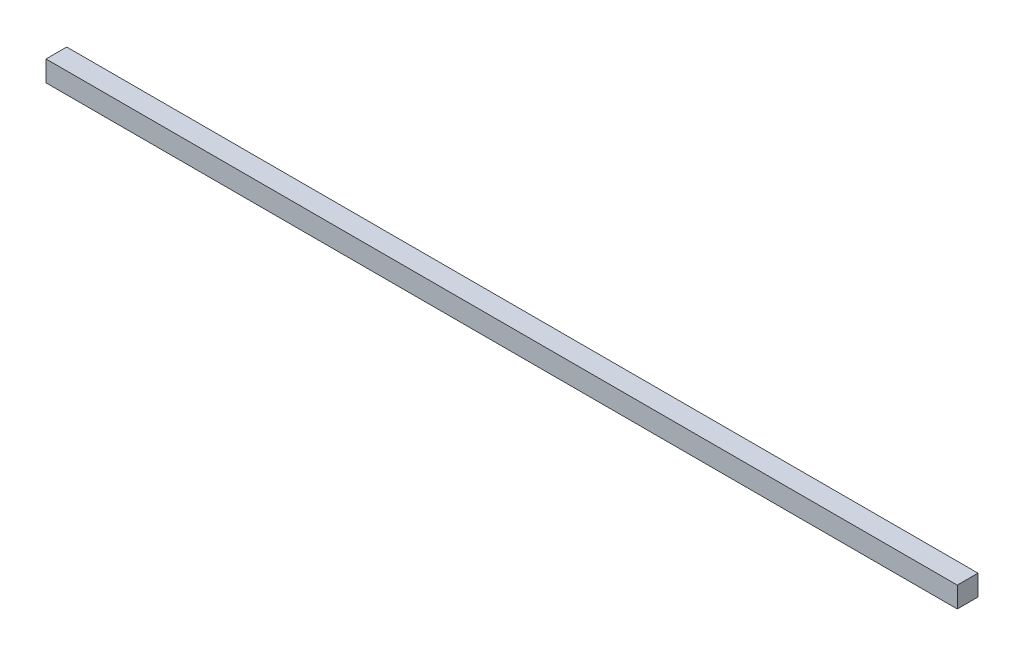
ISO-10303-21;
HEADER;
FILE_DESCRIPTION(('STEP AP214'),'2;1');
FILE_NAME('part.step','',(''),(''),'','','');
FILE_SCHEMA(('AUTOMOTIVE_DESIGN { 1 0 10303 214 1 1 1 1 }'));
ENDSEC;
DATA;
#1=APPLICATION_CONTEXT('core data for automotive mechanical design processes');
#2=APPLICATION_PROTOCOL_DEFINITION('international standard','automotive_design',2000,#1);
#3=PRODUCT_CONTEXT('',#1,'mechanical');
#4=PRODUCT('Part','Part','',(#3));
#5=PRODUCT_RELATED_PRODUCT_CATEGORY('part','',(#4));
#6=PRODUCT_DEFINITION_FORMATION('','',#4);
#7=PRODUCT_DEFINITION_CONTEXT('part definition',#1,'design');
#8=PRODUCT_DEFINITION('design','',#6,#7);
#9=PRODUCT_DEFINITION_SHAPE('','',#8);
#10=(LENGTH_UNIT() NAMED_UNIT(*) SI_UNIT(.MILLI.,.METRE.));
#11=(NAMED_UNIT(*) PLANE_ANGLE_UNIT() SI_UNIT($,.RADIAN.));
#12=(NAMED_UNIT(*) SI_UNIT($,.STERADIAN.) SOLID_ANGLE_UNIT());
#13=UNCERTAINTY_MEASURE_WITH_UNIT(LENGTH_MEASURE(1.E-05),#10,'distance_accuracy_value','');
#14=(GEOMETRIC_REPRESENTATION_CONTEXT(3) GLOBAL_UNCERTAINTY_ASSIGNED_CONTEXT((#13)) GLOBAL_UNIT_ASSIGNED_CONTEXT((#10,
#11,#12)) REPRESENTATION_CONTEXT('',''));
#15=CARTESIAN_POINT('',(0.,0.,0.));
#16=DIRECTION('',(0.,0.,1.));
#17=DIRECTION('',(1.,0.,0.));
#18=AXIS2_PLACEMENT_3D('',#15,#16,#17);
#19=CARTESIAN_POINT('',(0.,0.,3.));
#20=DIRECTION('',(1.,0.,0.));
#21=DIRECTION('',(0.,0.,-1.));
#22=AXIS2_PLACEMENT_3D('',#19,#20,#21);
#23=PLANE('',#22);
#24=DIRECTION('',(0.,-1.,0.));
#25=VECTOR('',#24,1.);
#26=CARTESIAN_POINT('',(0.,0.,0.));
#27=LINE('',#26,#25);
#28=CARTESIAN_POINT('',(0.,3.,0.));
#29=VERTEX_POINT('',#28);
#30=CARTESIAN_POINT('',(0.,0.,0.));
#31=VERTEX_POINT('',#30);
#32=EDGE_CURVE('E108',#29,#31,#27,.T.);
#33=ORIENTED_EDGE('',*,*,#32,.T.);
#34=DIRECTION('',(0.,0.,-1.));
#35=VECTOR('',#34,1.);
#36=CARTESIAN_POINT('',(0.,0.,3.));
#37=LINE('',#36,#35);
#38=CARTESIAN_POINT('',(0.,0.,3.));
#39=VERTEX_POINT('',#38);
#40=EDGE_CURVE('E11',#39,#31,#37,.T.);
#41=ORIENTED_EDGE('',*,*,#40,.F.);
#42=DIRECTION('',(0.,-1.,0.));
#43=VECTOR('',#42,1.);
#44=CARTESIAN_POINT('',(0.,0.,3.));
#45=LINE('',#44,#43);
#46=CARTESIAN_POINT('',(0.,3.,3.));
#47=VERTEX_POINT('',#46);
#48=EDGE_CURVE('E92',#47,#39,#45,.T.);
#49=ORIENTED_EDGE('',*,*,#48,.F.);
#50=DIRECTION('',(0.,0.,-1.));
#51=VECTOR('',#50,1.);
#52=CARTESIAN_POINT('',(0.,3.,3.));
#53=LINE('',#52,#51);
#54=EDGE_CURVE('E105',#47,#29,#53,.T.);
#55=ORIENTED_EDGE('',*,*,#54,.T.);
#56=EDGE_LOOP('',(#33,#41,#49,#55));
#57=FACE_BOUND('',#56,.T.);
#58=ADVANCED_FACE('F43',(#57),#23,.F.);
#59=CARTESIAN_POINT('',(0.,0.,3.));
#60=DIRECTION('',(0.,1.,0.));
#61=DIRECTION('',(0.,0.,1.));
#62=AXIS2_PLACEMENT_3D('',#59,#60,#61);
#63=PLANE('',#62);
#64=DIRECTION('',(1.,0.,0.));
#65=VECTOR('',#64,1.);
#66=CARTESIAN_POINT('',(0.,0.,0.));
#67=LINE('',#66,#65);
#68=CARTESIAN_POINT('',(132.,0.,0.));
#69=VERTEX_POINT('',#68);
#70=EDGE_CURVE('E97',#31,#69,#67,.T.);
#71=ORIENTED_EDGE('',*,*,#70,.T.);
#72=DIRECTION('',(0.,0.,-1.));
#73=VECTOR('',#72,1.);
#74=CARTESIAN_POINT('',(132.,0.,3.));
#75=LINE('',#74,#73);
#76=CARTESIAN_POINT('',(132.,0.,3.));
#77=VERTEX_POINT('',#76);
#78=EDGE_CURVE('E51',#77,#69,#75,.T.);
#79=ORIENTED_EDGE('',*,*,#78,.F.);
#80=DIRECTION('',(1.,0.,0.));
#81=VECTOR('',#80,1.);
#82=CARTESIAN_POINT('',(0.,0.,3.));
#83=LINE('',#82,#81);
#84=EDGE_CURVE('E87',#39,#77,#83,.T.);
#85=ORIENTED_EDGE('',*,*,#84,.F.);
#86=ORIENTED_EDGE('',*,*,#40,.T.);
#87=EDGE_LOOP('',(#71,#79,#85,#86));
#88=FACE_BOUND('',#87,.T.);
#89=ADVANCED_FACE('F100',(#88),#63,.F.);
#90=CARTESIAN_POINT('',(132.,0.,3.));
#91=DIRECTION('',(-1.,0.,0.));
#92=DIRECTION('',(0.,0.,1.));
#93=AXIS2_PLACEMENT_3D('',#90,#91,#92);
#94=PLANE('',#93);
#95=DIRECTION('',(0.,1.,0.));
#96=VECTOR('',#95,1.);
#97=CARTESIAN_POINT('',(132.,0.,0.));
#98=LINE('',#97,#96);
#99=CARTESIAN_POINT('',(132.,3.,0.));
#100=VERTEX_POINT('',#99);
#101=EDGE_CURVE('E78',#69,#100,#98,.T.);
#102=ORIENTED_EDGE('',*,*,#101,.T.);
#103=DIRECTION('',(0.,0.,-1.));
#104=VECTOR('',#103,1.);
#105=CARTESIAN_POINT('',(132.,3.,3.));
#106=LINE('',#105,#104);
#107=CARTESIAN_POINT('',(132.,3.,3.));
#108=VERTEX_POINT('',#107);
#109=EDGE_CURVE('E98',#108,#100,#106,.T.);
#110=ORIENTED_EDGE('',*,*,#109,.F.);
#111=DIRECTION('',(0.,1.,0.));
#112=VECTOR('',#111,1.);
#113=CARTESIAN_POINT('',(132.,0.,3.));
#114=LINE('',#113,#112);
#115=EDGE_CURVE('E95',#77,#108,#114,.T.);
#116=ORIENTED_EDGE('',*,*,#115,.F.);
#117=ORIENTED_EDGE('',*,*,#78,.T.);
#118=EDGE_LOOP('',(#102,#110,#116,#117));
#119=FACE_BOUND('',#118,.T.);
#120=ADVANCED_FACE('F99',(#119),#94,.F.);
#121=CARTESIAN_POINT('',(0.,3.,3.));
#122=DIRECTION('',(0.,-1.,0.));
#123=DIRECTION('',(0.,0.,-1.));
#124=AXIS2_PLACEMENT_3D('',#121,#122,#123);
#125=PLANE('',#124);
#126=DIRECTION('',(-1.,0.,0.));
#127=VECTOR('',#126,1.);
#128=CARTESIAN_POINT('',(0.,3.,0.));
#129=LINE('',#128,#127);
#130=EDGE_CURVE('E85',#100,#29,#129,.T.);
#131=ORIENTED_EDGE('',*,*,#130,.T.);
#132=ORIENTED_EDGE('',*,*,#54,.F.);
#133=DIRECTION('',(-1.,0.,0.));
#134=VECTOR('',#133,1.);
#135=CARTESIAN_POINT('',(0.,3.,3.));
#136=LINE('',#135,#134);
#137=EDGE_CURVE('E56',#108,#47,#136,.T.);
#138=ORIENTED_EDGE('',*,*,#137,.F.);
#139=ORIENTED_EDGE('',*,*,#109,.T.);
#140=EDGE_LOOP('',(#131,#132,#138,#139));
#141=FACE_BOUND('',#140,.T.);
#142=ADVANCED_FACE('F111',(#141),#125,.F.);
#143=CARTESIAN_POINT('',(0.,0.,3.));
#144=DIRECTION('',(0.,0.,-1.));
#145=DIRECTION('',(-1.,0.,0.));
#146=AXIS2_PLACEMENT_3D('',#143,#144,#145);
#147=PLANE('',#146);
#148=ORIENTED_EDGE('',*,*,#48,.T.);
#149=ORIENTED_EDGE('',*,*,#84,.T.);
#150=ORIENTED_EDGE('',*,*,#115,.T.);
#151=ORIENTED_EDGE('',*,*,#137,.T.);
#152=EDGE_LOOP('',(#148,#149,#150,#151));
#153=FACE_BOUND('',#152,.T.);
#154=ADVANCED_FACE('F89',(#153),#147,.F.);
#155=CARTESIAN_POINT('',(0.,0.,0.));
#156=DIRECTION('',(0.,0.,-1.));
#157=DIRECTION('',(-1.,0.,0.));
#158=AXIS2_PLACEMENT_3D('',#155,#156,#157);
#159=PLANE('',#158);
#160=ORIENTED_EDGE('',*,*,#32,.F.);
#161=ORIENTED_EDGE('',*,*,#130,.F.);
#162=ORIENTED_EDGE('',*,*,#101,.F.);
#163=ORIENTED_EDGE('',*,*,#70,.F.);
#164=EDGE_LOOP('',(#160,#161,#162,#163));
#165=FACE_BOUND('',#164,.T.);
#166=ADVANCED_FACE('F118',(#165),#159,.T.);
#167=CLOSED_SHELL('',(#58,#89,#120,#142,#154,#166));
#168=MANIFOLD_SOLID_BREP('B2',#167);
#169=ADVANCED_BREP_SHAPE_REPRESENTATION('',(#18,#168),#14);
#170=SHAPE_DEFINITION_REPRESENTATION(#9,#169);
ENDSEC;
END-ISO-10303-21;
